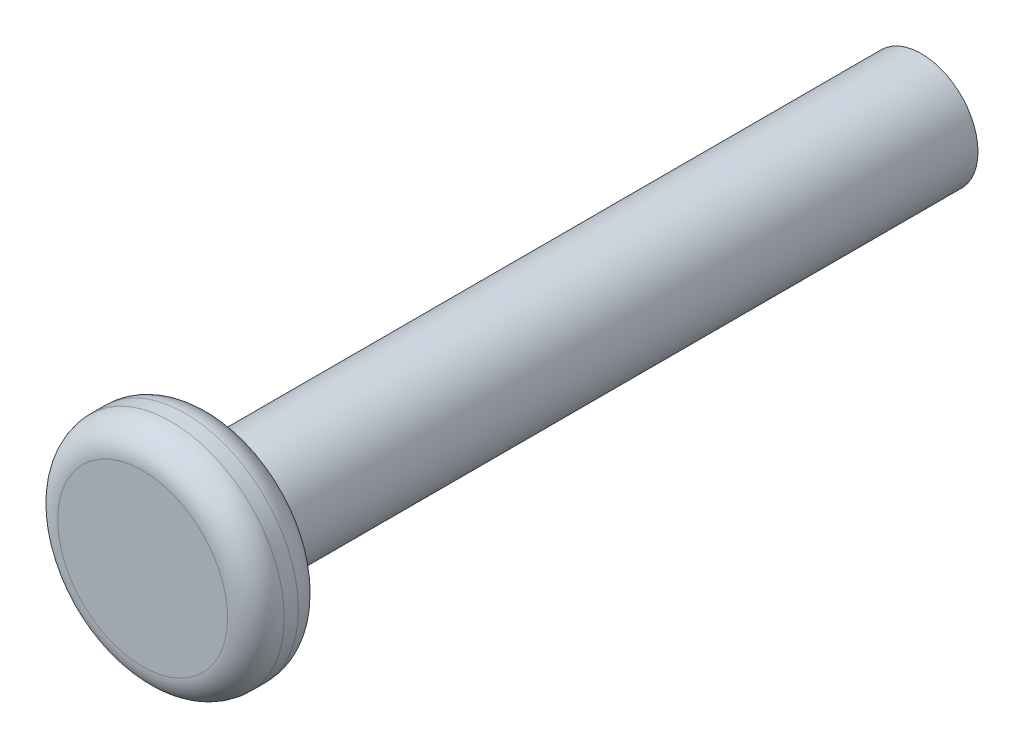
ISO-10303-21;
HEADER;
FILE_DESCRIPTION(('STEP AP214'),'2;1');
FILE_NAME('part.step','',(''),(''),'','','');
FILE_SCHEMA(('AUTOMOTIVE_DESIGN { 1 0 10303 214 1 1 1 1 }'));
ENDSEC;
DATA;
#1=APPLICATION_CONTEXT('core data for automotive mechanical design processes');
#2=APPLICATION_PROTOCOL_DEFINITION('international standard','automotive_design',2000,#1);
#3=PRODUCT_CONTEXT('',#1,'mechanical');
#4=PRODUCT('Part','Part','',(#3));
#5=PRODUCT_RELATED_PRODUCT_CATEGORY('part','',(#4));
#6=PRODUCT_DEFINITION_FORMATION('','',#4);
#7=PRODUCT_DEFINITION_CONTEXT('part definition',#1,'design');
#8=PRODUCT_DEFINITION('design','',#6,#7);
#9=PRODUCT_DEFINITION_SHAPE('','',#8);
#10=(LENGTH_UNIT() NAMED_UNIT(*) SI_UNIT(.MILLI.,.METRE.));
#11=(NAMED_UNIT(*) PLANE_ANGLE_UNIT() SI_UNIT($,.RADIAN.));
#12=(NAMED_UNIT(*) SI_UNIT($,.STERADIAN.) SOLID_ANGLE_UNIT());
#13=UNCERTAINTY_MEASURE_WITH_UNIT(LENGTH_MEASURE(1.E-05),#10,'distance_accuracy_value','');
#14=(GEOMETRIC_REPRESENTATION_CONTEXT(3) GLOBAL_UNCERTAINTY_ASSIGNED_CONTEXT((#13)) GLOBAL_UNIT_ASSIGNED_CONTEXT((#10,
#11,#12)) REPRESENTATION_CONTEXT('',''));
#15=CARTESIAN_POINT('',(0.,0.,0.));
#16=DIRECTION('',(0.,0.,1.));
#17=DIRECTION('',(1.,0.,0.));
#18=AXIS2_PLACEMENT_3D('',#15,#16,#17);
#19=CARTESIAN_POINT('',(0.,0.,50.));
#20=DIRECTION('',(0.,0.,-1.));
#21=DIRECTION('',(-1.,0.,0.));
#22=AXIS2_PLACEMENT_3D('',#19,#20,#21);
#23=CYLINDRICAL_SURFACE('',#22,4.);
#24=CARTESIAN_POINT('',(0.,0.,50.));
#25=DIRECTION('',(0.,0.,1.));
#26=DIRECTION('',(1.,0.,0.));
#27=AXIS2_PLACEMENT_3D('',#24,#25,#26);
#28=CIRCLE('',#27,4.);
#29=CARTESIAN_POINT('',(4.,0.,50.));
#30=VERTEX_POINT('',#29);
#31=EDGE_CURVE('E67',#30,#30,#28,.T.);
#32=ORIENTED_EDGE('',*,*,#31,.F.);
#33=EDGE_LOOP('',(#32));
#34=FACE_BOUND('',#33,.T.);
#35=CARTESIAN_POINT('',(0.,0.,0.));
#36=DIRECTION('',(0.,0.,1.));
#37=DIRECTION('',(1.,0.,0.));
#38=AXIS2_PLACEMENT_3D('',#35,#36,#37);
#39=CIRCLE('',#38,4.);
#40=CARTESIAN_POINT('',(4.,0.,0.));
#41=VERTEX_POINT('',#40);
#42=EDGE_CURVE('E68',#41,#41,#39,.T.);
#43=ORIENTED_EDGE('',*,*,#42,.T.);
#44=EDGE_LOOP('',(#43));
#45=FACE_BOUND('',#44,.T.);
#46=ADVANCED_FACE('F43',(#34,#45),#23,.T.);
#47=CARTESIAN_POINT('',(0.,0.,0.));
#48=DIRECTION('',(0.,0.,1.));
#49=DIRECTION('',(1.,0.,0.));
#50=AXIS2_PLACEMENT_3D('',#47,#48,#49);
#51=PLANE('',#50);
#52=ORIENTED_EDGE('',*,*,#42,.F.);
#53=EDGE_LOOP('',(#52));
#54=FACE_BOUND('',#53,.T.);
#55=ADVANCED_FACE('F80',(#54),#51,.F.);
#56=CARTESIAN_POINT('',(0.,0.,55.));
#57=DIRECTION('',(0.,0.,-1.));
#58=DIRECTION('',(-1.,0.,0.));
#59=AXIS2_PLACEMENT_3D('',#56,#57,#58);
#60=CYLINDRICAL_SURFACE('',#59,8.);
#61=CARTESIAN_POINT('',(0.,0.,52.));
#62=DIRECTION('',(0.,0.,1.));
#63=DIRECTION('',(1.,0.,0.));
#64=AXIS2_PLACEMENT_3D('',#61,#62,#63);
#65=CIRCLE('',#64,8.);
#66=CARTESIAN_POINT('',(8.,0.,52.));
#67=VERTEX_POINT('',#66);
#68=EDGE_CURVE('E56',#67,#67,#65,.T.);
#69=ORIENTED_EDGE('',*,*,#68,.T.);
#70=EDGE_LOOP('',(#69));
#71=FACE_BOUND('',#70,.T.);
#72=CARTESIAN_POINT('',(0.,0.,53.));
#73=DIRECTION('',(0.,0.,1.));
#74=DIRECTION('',(1.,0.,0.));
#75=AXIS2_PLACEMENT_3D('',#72,#73,#74);
#76=CIRCLE('',#75,8.);
#77=CARTESIAN_POINT('',(8.,0.,53.));
#78=VERTEX_POINT('',#77);
#79=EDGE_CURVE('E61',#78,#78,#76,.F.);
#80=ORIENTED_EDGE('',*,*,#79,.T.);
#81=EDGE_LOOP('',(#80));
#82=FACE_BOUND('',#81,.T.);
#83=ADVANCED_FACE('F85',(#71,#82),#60,.T.);
#84=CARTESIAN_POINT('',(0.,0.,55.));
#85=DIRECTION('',(0.,0.,1.));
#86=DIRECTION('',(1.,0.,0.));
#87=AXIS2_PLACEMENT_3D('',#84,#85,#86);
#88=PLANE('',#87);
#89=CARTESIAN_POINT('',(0.,0.,55.));
#90=DIRECTION('',(0.,0.,1.));
#91=DIRECTION('',(1.,0.,0.));
#92=AXIS2_PLACEMENT_3D('',#89,#90,#91);
#93=CIRCLE('',#92,6.);
#94=CARTESIAN_POINT('',(6.,0.,55.));
#95=VERTEX_POINT('',#94);
#96=EDGE_CURVE('E10',#95,#95,#93,.T.);
#97=ORIENTED_EDGE('',*,*,#96,.T.);
#98=EDGE_LOOP('',(#97));
#99=FACE_BOUND('',#98,.T.);
#100=ADVANCED_FACE('F90',(#99),#88,.T.);
#101=CARTESIAN_POINT('',(0.,0.,50.));
#102=DIRECTION('',(0.,0.,1.));
#103=DIRECTION('',(1.,0.,0.));
#104=AXIS2_PLACEMENT_3D('',#101,#102,#103);
#105=PLANE('',#104);
#106=CARTESIAN_POINT('',(0.,0.,50.));
#107=DIRECTION('',(0.,0.,1.));
#108=DIRECTION('',(1.,0.,0.));
#109=AXIS2_PLACEMENT_3D('',#106,#107,#108);
#110=CIRCLE('',#109,6.);
#111=CARTESIAN_POINT('',(6.,0.,50.));
#112=VERTEX_POINT('',#111);
#113=EDGE_CURVE('E51',#112,#112,#110,.F.);
#114=ORIENTED_EDGE('',*,*,#113,.T.);
#115=EDGE_LOOP('',(#114));
#116=FACE_BOUND('',#115,.T.);
#117=ORIENTED_EDGE('',*,*,#31,.T.);
#118=EDGE_LOOP('',(#117));
#119=FACE_BOUND('',#118,.T.);
#120=ADVANCED_FACE('F76',(#116,#119),#105,.F.);
#121=CARTESIAN_POINT('',(0.,0.,52.));
#122=DIRECTION('',(0.,0.,1.));
#123=DIRECTION('',(1.,0.,0.));
#124=AXIS2_PLACEMENT_3D('',#121,#122,#123);
#125=TOROIDAL_SURFACE('',#124,6.,2.);
#126=ORIENTED_EDGE('',*,*,#113,.F.);
#127=EDGE_LOOP('',(#126));
#128=FACE_BOUND('',#127,.T.);
#129=ORIENTED_EDGE('',*,*,#68,.F.);
#130=EDGE_LOOP('',(#129));
#131=FACE_BOUND('',#130,.T.);
#132=ADVANCED_FACE('F94',(#128,#131),#125,.T.);
#133=CARTESIAN_POINT('',(0.,0.,53.));
#134=DIRECTION('',(0.,0.,1.));
#135=DIRECTION('',(1.,0.,0.));
#136=AXIS2_PLACEMENT_3D('',#133,#134,#135);
#137=TOROIDAL_SURFACE('',#136,6.,2.);
#138=ORIENTED_EDGE('',*,*,#79,.F.);
#139=EDGE_LOOP('',(#138));
#140=FACE_BOUND('',#139,.T.);
#141=ORIENTED_EDGE('',*,*,#96,.F.);
#142=EDGE_LOOP('',(#141));
#143=FACE_BOUND('',#142,.T.);
#144=ADVANCED_FACE('F45',(#140,#143),#137,.T.);
#145=CLOSED_SHELL('',(#46,#55,#83,#100,#120,#132,#144));
#146=MANIFOLD_SOLID_BREP('B2',#145);
#147=ADVANCED_BREP_SHAPE_REPRESENTATION('',(#18,#146),#14);
#148=SHAPE_DEFINITION_REPRESENTATION(#9,#147);
ENDSEC;
END-ISO-10303-21;
